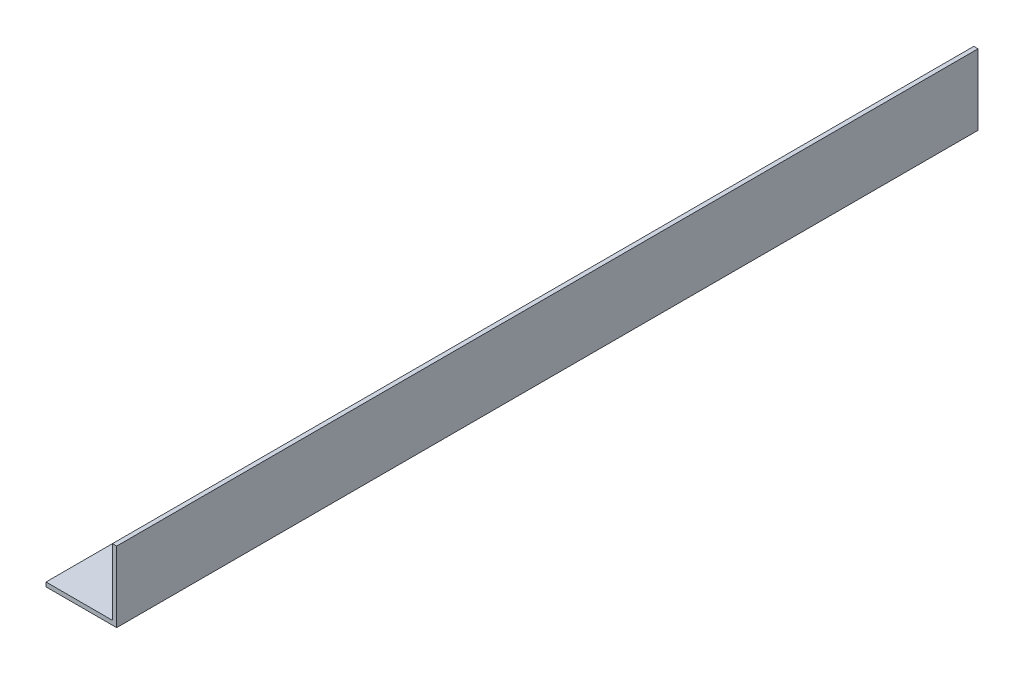
ISO-10303-21;
HEADER;
FILE_DESCRIPTION(('STEP AP214'),'2;1');
FILE_NAME('part.step','',(''),(''),'','','');
FILE_SCHEMA(('AUTOMOTIVE_DESIGN { 1 0 10303 214 1 1 1 1 }'));
ENDSEC;
DATA;
#1=APPLICATION_CONTEXT('core data for automotive mechanical design processes');
#2=APPLICATION_PROTOCOL_DEFINITION('international standard','automotive_design',2000,#1);
#3=PRODUCT_CONTEXT('',#1,'mechanical');
#4=PRODUCT('Part','Part','',(#3));
#5=PRODUCT_RELATED_PRODUCT_CATEGORY('part','',(#4));
#6=PRODUCT_DEFINITION_FORMATION('','',#4);
#7=PRODUCT_DEFINITION_CONTEXT('part definition',#1,'design');
#8=PRODUCT_DEFINITION('design','',#6,#7);
#9=PRODUCT_DEFINITION_SHAPE('','',#8);
#10=(LENGTH_UNIT() NAMED_UNIT(*) SI_UNIT(.MILLI.,.METRE.));
#11=(NAMED_UNIT(*) PLANE_ANGLE_UNIT() SI_UNIT($,.RADIAN.));
#12=(NAMED_UNIT(*) SI_UNIT($,.STERADIAN.) SOLID_ANGLE_UNIT());
#13=UNCERTAINTY_MEASURE_WITH_UNIT(LENGTH_MEASURE(1.E-05),#10,'distance_accuracy_value','');
#14=(GEOMETRIC_REPRESENTATION_CONTEXT(3) GLOBAL_UNCERTAINTY_ASSIGNED_CONTEXT((#13)) GLOBAL_UNIT_ASSIGNED_CONTEXT((#10,
#11,#12)) REPRESENTATION_CONTEXT('',''));
#15=CARTESIAN_POINT('',(0.,0.,0.));
#16=DIRECTION('',(0.,0.,1.));
#17=DIRECTION('',(1.,0.,0.));
#18=AXIS2_PLACEMENT_3D('',#15,#16,#17);
#19=CARTESIAN_POINT('',(-50.,0.,304.8));
#20=DIRECTION('',(1.,0.,0.));
#21=DIRECTION('',(0.,0.,-1.));
#22=AXIS2_PLACEMENT_3D('',#19,#20,#21);
#23=PLANE('',#22);
#24=DIRECTION('',(0.,0.,-1.));
#25=VECTOR('',#24,1.);
#26=CARTESIAN_POINT('',(-50.,2.99999999999999,304.8));
#27=LINE('',#26,#25);
#28=CARTESIAN_POINT('',(-50.,2.99999999999999,304.8));
#29=VERTEX_POINT('',#28);
#30=CARTESIAN_POINT('',(-50.,2.99999999999999,-304.8));
#31=VERTEX_POINT('',#30);
#32=EDGE_CURVE('E104',#29,#31,#27,.T.);
#33=ORIENTED_EDGE('',*,*,#32,.T.);
#34=DIRECTION('',(0.,-1.,0.));
#35=VECTOR('',#34,1.);
#36=CARTESIAN_POINT('',(-50.,0.,-304.8));
#37=LINE('',#36,#35);
#38=CARTESIAN_POINT('',(-50.,0.,-304.8));
#39=VERTEX_POINT('',#38);
#40=EDGE_CURVE('E98',#31,#39,#37,.T.);
#41=ORIENTED_EDGE('',*,*,#40,.T.);
#42=DIRECTION('',(0.,0.,-1.));
#43=VECTOR('',#42,1.);
#44=CARTESIAN_POINT('',(-50.,0.,304.8));
#45=LINE('',#44,#43);
#46=CARTESIAN_POINT('',(-50.,0.,304.8));
#47=VERTEX_POINT('',#46);
#48=EDGE_CURVE('E11',#47,#39,#45,.T.);
#49=ORIENTED_EDGE('',*,*,#48,.F.);
#50=DIRECTION('',(0.,-1.,0.));
#51=VECTOR('',#50,1.);
#52=CARTESIAN_POINT('',(-50.,0.,304.8));
#53=LINE('',#52,#51);
#54=EDGE_CURVE('E116',#29,#47,#53,.T.);
#55=ORIENTED_EDGE('',*,*,#54,.F.);
#56=EDGE_LOOP('',(#33,#41,#49,#55));
#57=FACE_BOUND('',#56,.T.);
#58=ADVANCED_FACE('F34',(#57),#23,.F.);
#59=CARTESIAN_POINT('',(-50.,0.,304.8));
#60=DIRECTION('',(0.,1.,0.));
#61=DIRECTION('',(0.,0.,1.));
#62=AXIS2_PLACEMENT_3D('',#59,#60,#61);
#63=PLANE('',#62);
#64=ORIENTED_EDGE('',*,*,#48,.T.);
#65=DIRECTION('',(1.,0.,0.));
#66=VECTOR('',#65,1.);
#67=CARTESIAN_POINT('',(-50.,0.,-304.8));
#68=LINE('',#67,#66);
#69=CARTESIAN_POINT('',(0.,0.,-304.8));
#70=VERTEX_POINT('',#69);
#71=EDGE_CURVE('E88',#39,#70,#68,.T.);
#72=ORIENTED_EDGE('',*,*,#71,.T.);
#73=DIRECTION('',(0.,0.,-1.));
#74=VECTOR('',#73,1.);
#75=CARTESIAN_POINT('',(0.,0.,304.8));
#76=LINE('',#75,#74);
#77=CARTESIAN_POINT('',(0.,0.,304.8));
#78=VERTEX_POINT('',#77);
#79=EDGE_CURVE('E41',#78,#70,#76,.T.);
#80=ORIENTED_EDGE('',*,*,#79,.F.);
#81=DIRECTION('',(1.,0.,0.));
#82=VECTOR('',#81,1.);
#83=CARTESIAN_POINT('',(-50.,0.,304.8));
#84=LINE('',#83,#82);
#85=EDGE_CURVE('E89',#47,#78,#84,.T.);
#86=ORIENTED_EDGE('',*,*,#85,.F.);
#87=EDGE_LOOP('',(#64,#72,#80,#86));
#88=FACE_BOUND('',#87,.T.);
#89=ADVANCED_FACE('F86',(#88),#63,.F.);
#90=CARTESIAN_POINT('',(0.,0.,304.8));
#91=DIRECTION('',(-1.,0.,0.));
#92=DIRECTION('',(0.,0.,1.));
#93=AXIS2_PLACEMENT_3D('',#90,#91,#92);
#94=PLANE('',#93);
#95=ORIENTED_EDGE('',*,*,#79,.T.);
#96=DIRECTION('',(0.,1.,0.));
#97=VECTOR('',#96,1.);
#98=CARTESIAN_POINT('',(0.,0.,-304.8));
#99=LINE('',#98,#97);
#100=CARTESIAN_POINT('',(0.,50.,-304.8));
#101=VERTEX_POINT('',#100);
#102=EDGE_CURVE('E102',#70,#101,#99,.T.);
#103=ORIENTED_EDGE('',*,*,#102,.T.);
#104=DIRECTION('',(0.,0.,-1.));
#105=VECTOR('',#104,1.);
#106=CARTESIAN_POINT('',(0.,50.,304.8));
#107=LINE('',#106,#105);
#108=CARTESIAN_POINT('',(0.,50.,304.8));
#109=VERTEX_POINT('',#108);
#110=EDGE_CURVE('E130',#109,#101,#107,.T.);
#111=ORIENTED_EDGE('',*,*,#110,.F.);
#112=DIRECTION('',(0.,1.,0.));
#113=VECTOR('',#112,1.);
#114=CARTESIAN_POINT('',(0.,0.,304.8));
#115=LINE('',#114,#113);
#116=EDGE_CURVE('E119',#78,#109,#115,.T.);
#117=ORIENTED_EDGE('',*,*,#116,.F.);
#118=EDGE_LOOP('',(#95,#103,#111,#117));
#119=FACE_BOUND('',#118,.T.);
#120=ADVANCED_FACE('F133',(#119),#94,.F.);
#121=CARTESIAN_POINT('',(0.,50.,304.8));
#122=DIRECTION('',(0.,-1.,0.));
#123=DIRECTION('',(0.,0.,-1.));
#124=AXIS2_PLACEMENT_3D('',#121,#122,#123);
#125=PLANE('',#124);
#126=ORIENTED_EDGE('',*,*,#110,.T.);
#127=DIRECTION('',(-1.,0.,0.));
#128=VECTOR('',#127,1.);
#129=CARTESIAN_POINT('',(0.,50.,-304.8));
#130=LINE('',#129,#128);
#131=CARTESIAN_POINT('',(-2.99999999999999,50.,-304.8));
#132=VERTEX_POINT('',#131);
#133=EDGE_CURVE('E108',#101,#132,#130,.T.);
#134=ORIENTED_EDGE('',*,*,#133,.T.);
#135=DIRECTION('',(0.,0.,-1.));
#136=VECTOR('',#135,1.);
#137=CARTESIAN_POINT('',(-2.99999999999999,50.,304.8));
#138=LINE('',#137,#136);
#139=CARTESIAN_POINT('',(-2.99999999999999,50.,304.8));
#140=VERTEX_POINT('',#139);
#141=EDGE_CURVE('E128',#140,#132,#138,.T.);
#142=ORIENTED_EDGE('',*,*,#141,.F.);
#143=DIRECTION('',(-1.,0.,0.));
#144=VECTOR('',#143,1.);
#145=CARTESIAN_POINT('',(0.,50.,304.8));
#146=LINE('',#145,#144);
#147=EDGE_CURVE('E121',#109,#140,#146,.T.);
#148=ORIENTED_EDGE('',*,*,#147,.F.);
#149=EDGE_LOOP('',(#126,#134,#142,#148));
#150=FACE_BOUND('',#149,.T.);
#151=ADVANCED_FACE('F139',(#150),#125,.F.);
#152=CARTESIAN_POINT('',(-2.99999999999999,50.,304.8));
#153=DIRECTION('',(1.,0.,0.));
#154=DIRECTION('',(0.,1.,0.));
#155=AXIS2_PLACEMENT_3D('',#152,#153,#154);
#156=PLANE('',#155);
#157=ORIENTED_EDGE('',*,*,#141,.T.);
#158=DIRECTION('',(0.,-1.,0.));
#159=VECTOR('',#158,1.);
#160=CARTESIAN_POINT('',(-2.99999999999999,50.,-304.8));
#161=LINE('',#160,#159);
#162=CARTESIAN_POINT('',(-2.99999999999999,3.,-304.8));
#163=VERTEX_POINT('',#162);
#164=EDGE_CURVE('E111',#132,#163,#161,.T.);
#165=ORIENTED_EDGE('',*,*,#164,.T.);
#166=DIRECTION('',(0.,0.,-1.));
#167=VECTOR('',#166,1.);
#168=CARTESIAN_POINT('',(-2.99999999999999,3.,304.8));
#169=LINE('',#168,#167);
#170=CARTESIAN_POINT('',(-2.99999999999999,3.,304.8));
#171=VERTEX_POINT('',#170);
#172=EDGE_CURVE('E126',#171,#163,#169,.T.);
#173=ORIENTED_EDGE('',*,*,#172,.F.);
#174=DIRECTION('',(0.,-1.,0.));
#175=VECTOR('',#174,1.);
#176=CARTESIAN_POINT('',(-2.99999999999999,50.,304.8));
#177=LINE('',#176,#175);
#178=EDGE_CURVE('E53',#140,#171,#177,.T.);
#179=ORIENTED_EDGE('',*,*,#178,.F.);
#180=EDGE_LOOP('',(#157,#165,#173,#179));
#181=FACE_BOUND('',#180,.T.);
#182=ADVANCED_FACE('F142',(#181),#156,.F.);
#183=CARTESIAN_POINT('',(-2.99999999999999,3.,304.8));
#184=DIRECTION('',(0.,-1.,0.));
#185=DIRECTION('',(1.,0.,0.));
#186=AXIS2_PLACEMENT_3D('',#183,#184,#185);
#187=PLANE('',#186);
#188=ORIENTED_EDGE('',*,*,#172,.T.);
#189=DIRECTION('',(-1.,0.,0.));
#190=VECTOR('',#189,1.);
#191=CARTESIAN_POINT('',(-2.99999999999999,3.,-304.8));
#192=LINE('',#191,#190);
#193=EDGE_CURVE('E114',#163,#31,#192,.T.);
#194=ORIENTED_EDGE('',*,*,#193,.T.);
#195=ORIENTED_EDGE('',*,*,#32,.F.);
#196=DIRECTION('',(-1.,0.,0.));
#197=VECTOR('',#196,1.);
#198=CARTESIAN_POINT('',(-2.99999999999999,3.,304.8));
#199=LINE('',#198,#197);
#200=EDGE_CURVE('E48',#171,#29,#199,.T.);
#201=ORIENTED_EDGE('',*,*,#200,.F.);
#202=EDGE_LOOP('',(#188,#194,#195,#201));
#203=FACE_BOUND('',#202,.T.);
#204=ADVANCED_FACE('F144',(#203),#187,.F.);
#205=CARTESIAN_POINT('',(0.,0.,304.8));
#206=DIRECTION('',(0.,0.,1.));
#207=DIRECTION('',(1.,0.,0.));
#208=AXIS2_PLACEMENT_3D('',#205,#206,#207);
#209=PLANE('',#208);
#210=ORIENTED_EDGE('',*,*,#54,.T.);
#211=ORIENTED_EDGE('',*,*,#85,.T.);
#212=ORIENTED_EDGE('',*,*,#116,.T.);
#213=ORIENTED_EDGE('',*,*,#147,.T.);
#214=ORIENTED_EDGE('',*,*,#178,.T.);
#215=ORIENTED_EDGE('',*,*,#200,.T.);
#216=EDGE_LOOP('',(#210,#211,#212,#213,#214,#215));
#217=FACE_BOUND('',#216,.T.);
#218=ADVANCED_FACE('F136',(#217),#209,.T.);
#219=CARTESIAN_POINT('',(0.,0.,-304.8));
#220=DIRECTION('',(0.,0.,1.));
#221=DIRECTION('',(1.,0.,0.));
#222=AXIS2_PLACEMENT_3D('',#219,#220,#221);
#223=PLANE('',#222);
#224=ORIENTED_EDGE('',*,*,#40,.F.);
#225=ORIENTED_EDGE('',*,*,#193,.F.);
#226=ORIENTED_EDGE('',*,*,#164,.F.);
#227=ORIENTED_EDGE('',*,*,#133,.F.);
#228=ORIENTED_EDGE('',*,*,#102,.F.);
#229=ORIENTED_EDGE('',*,*,#71,.F.);
#230=EDGE_LOOP('',(#224,#225,#226,#227,#228,#229));
#231=FACE_BOUND('',#230,.T.);
#232=ADVANCED_FACE('F96',(#231),#223,.F.);
#233=CLOSED_SHELL('',(#58,#89,#120,#151,#182,#204,#218,#232));
#234=MANIFOLD_SOLID_BREP('B2',#233);
#235=ADVANCED_BREP_SHAPE_REPRESENTATION('',(#18,#234),#14);
#236=SHAPE_DEFINITION_REPRESENTATION(#9,#235);
ENDSEC;
END-ISO-10303-21;
